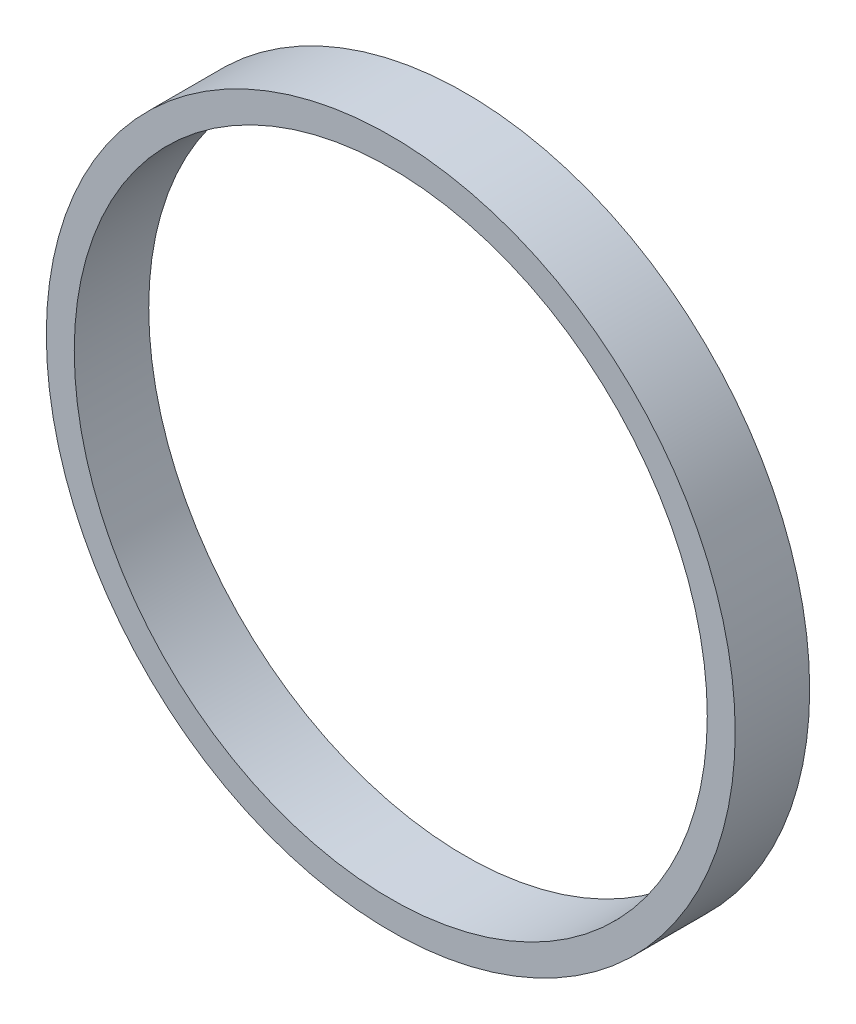
ISO-10303-21;
HEADER;
FILE_DESCRIPTION(('STEP AP214'),'2;1');
FILE_NAME('part.step','',(''),(''),'','','');
FILE_SCHEMA(('AUTOMOTIVE_DESIGN { 1 0 10303 214 1 1 1 1 }'));
ENDSEC;
DATA;
#1=APPLICATION_CONTEXT('core data for automotive mechanical design processes');
#2=APPLICATION_PROTOCOL_DEFINITION('international standard','automotive_design',2000,#1);
#3=PRODUCT_CONTEXT('',#1,'mechanical');
#4=PRODUCT('Part','Part','',(#3));
#5=PRODUCT_RELATED_PRODUCT_CATEGORY('part','',(#4));
#6=PRODUCT_DEFINITION_FORMATION('','',#4);
#7=PRODUCT_DEFINITION_CONTEXT('part definition',#1,'design');
#8=PRODUCT_DEFINITION('design','',#6,#7);
#9=PRODUCT_DEFINITION_SHAPE('','',#8);
#10=(LENGTH_UNIT() NAMED_UNIT(*) SI_UNIT(.MILLI.,.METRE.));
#11=(NAMED_UNIT(*) PLANE_ANGLE_UNIT() SI_UNIT($,.RADIAN.));
#12=(NAMED_UNIT(*) SI_UNIT($,.STERADIAN.) SOLID_ANGLE_UNIT());
#13=UNCERTAINTY_MEASURE_WITH_UNIT(LENGTH_MEASURE(1.E-05),#10,'distance_accuracy_value','');
#14=(GEOMETRIC_REPRESENTATION_CONTEXT(3) GLOBAL_UNCERTAINTY_ASSIGNED_CONTEXT((#13)) GLOBAL_UNIT_ASSIGNED_CONTEXT((#10,
#11,#12)) REPRESENTATION_CONTEXT('',''));
#15=CARTESIAN_POINT('',(0.,0.,0.));
#16=DIRECTION('',(0.,0.,1.));
#17=DIRECTION('',(1.,0.,0.));
#18=AXIS2_PLACEMENT_3D('',#15,#16,#17);
#19=CARTESIAN_POINT('',(0.,0.,4.));
#20=DIRECTION('',(0.,0.,1.));
#21=DIRECTION('',(1.,0.,0.));
#22=AXIS2_PLACEMENT_3D('',#19,#20,#21);
#23=PLANE('',#22);
#24=CARTESIAN_POINT('',(0.,0.,4.));
#25=DIRECTION('',(0.,0.,1.));
#26=DIRECTION('',(1.,0.,0.));
#27=AXIS2_PLACEMENT_3D('',#24,#25,#26);
#28=CIRCLE('',#27,18.5);
#29=CARTESIAN_POINT('',(18.5,0.,4.));
#30=VERTEX_POINT('',#29);
#31=EDGE_CURVE('E10',#30,#30,#28,.T.);
#32=ORIENTED_EDGE('',*,*,#31,.T.);
#33=EDGE_LOOP('',(#32));
#34=FACE_BOUND('',#33,.T.);
#35=CARTESIAN_POINT('',(0.,0.,4.));
#36=DIRECTION('',(0.,0.,1.));
#37=DIRECTION('',(1.,0.,0.));
#38=AXIS2_PLACEMENT_3D('',#35,#36,#37);
#39=CIRCLE('',#38,17.);
#40=CARTESIAN_POINT('',(17.,0.,4.));
#41=VERTEX_POINT('',#40);
#42=EDGE_CURVE('E50',#41,#41,#39,.T.);
#43=ORIENTED_EDGE('',*,*,#42,.F.);
#44=EDGE_LOOP('',(#43));
#45=FACE_BOUND('',#44,.T.);
#46=ADVANCED_FACE('F37',(#34,#45),#23,.T.);
#47=CARTESIAN_POINT('',(0.,0.,0.));
#48=DIRECTION('',(0.,0.,1.));
#49=DIRECTION('',(1.,0.,0.));
#50=AXIS2_PLACEMENT_3D('',#47,#48,#49);
#51=PLANE('',#50);
#52=CARTESIAN_POINT('',(0.,0.,0.));
#53=DIRECTION('',(0.,0.,1.));
#54=DIRECTION('',(1.,0.,0.));
#55=AXIS2_PLACEMENT_3D('',#52,#53,#54);
#56=CIRCLE('',#55,18.5);
#57=CARTESIAN_POINT('',(18.5,0.,0.));
#58=VERTEX_POINT('',#57);
#59=EDGE_CURVE('E41',#58,#58,#56,.T.);
#60=ORIENTED_EDGE('',*,*,#59,.F.);
#61=EDGE_LOOP('',(#60));
#62=FACE_BOUND('',#61,.T.);
#63=CARTESIAN_POINT('',(0.,0.,0.));
#64=DIRECTION('',(0.,0.,1.));
#65=DIRECTION('',(1.,0.,0.));
#66=AXIS2_PLACEMENT_3D('',#63,#64,#65);
#67=CIRCLE('',#66,17.);
#68=CARTESIAN_POINT('',(17.,0.,0.));
#69=VERTEX_POINT('',#68);
#70=EDGE_CURVE('E52',#69,#69,#67,.T.);
#71=ORIENTED_EDGE('',*,*,#70,.T.);
#72=EDGE_LOOP('',(#71));
#73=FACE_BOUND('',#72,.T.);
#74=ADVANCED_FACE('F64',(#62,#73),#51,.F.);
#75=CARTESIAN_POINT('',(0.,0.,4.));
#76=DIRECTION('',(0.,0.,-1.));
#77=DIRECTION('',(-1.,0.,0.));
#78=AXIS2_PLACEMENT_3D('',#75,#76,#77);
#79=CYLINDRICAL_SURFACE('',#78,18.5);
#80=ORIENTED_EDGE('',*,*,#31,.F.);
#81=EDGE_LOOP('',(#80));
#82=FACE_BOUND('',#81,.T.);
#83=ORIENTED_EDGE('',*,*,#59,.T.);
#84=EDGE_LOOP('',(#83));
#85=FACE_BOUND('',#84,.T.);
#86=ADVANCED_FACE('F39',(#82,#85),#79,.T.);
#87=CARTESIAN_POINT('',(0.,0.,4.));
#88=DIRECTION('',(0.,0.,-1.));
#89=DIRECTION('',(-1.,0.,0.));
#90=AXIS2_PLACEMENT_3D('',#87,#88,#89);
#91=CYLINDRICAL_SURFACE('',#90,17.);
#92=ORIENTED_EDGE('',*,*,#42,.T.);
#93=EDGE_LOOP('',(#92));
#94=FACE_BOUND('',#93,.T.);
#95=ORIENTED_EDGE('',*,*,#70,.F.);
#96=EDGE_LOOP('',(#95));
#97=FACE_BOUND('',#96,.T.);
#98=ADVANCED_FACE('F60',(#94,#97),#91,.F.);
#99=CLOSED_SHELL('',(#46,#74,#86,#98));
#100=MANIFOLD_SOLID_BREP('B2',#99);
#101=ADVANCED_BREP_SHAPE_REPRESENTATION('',(#18,#100),#14);
#102=SHAPE_DEFINITION_REPRESENTATION(#9,#101);
ENDSEC;
END-ISO-10303-21;
